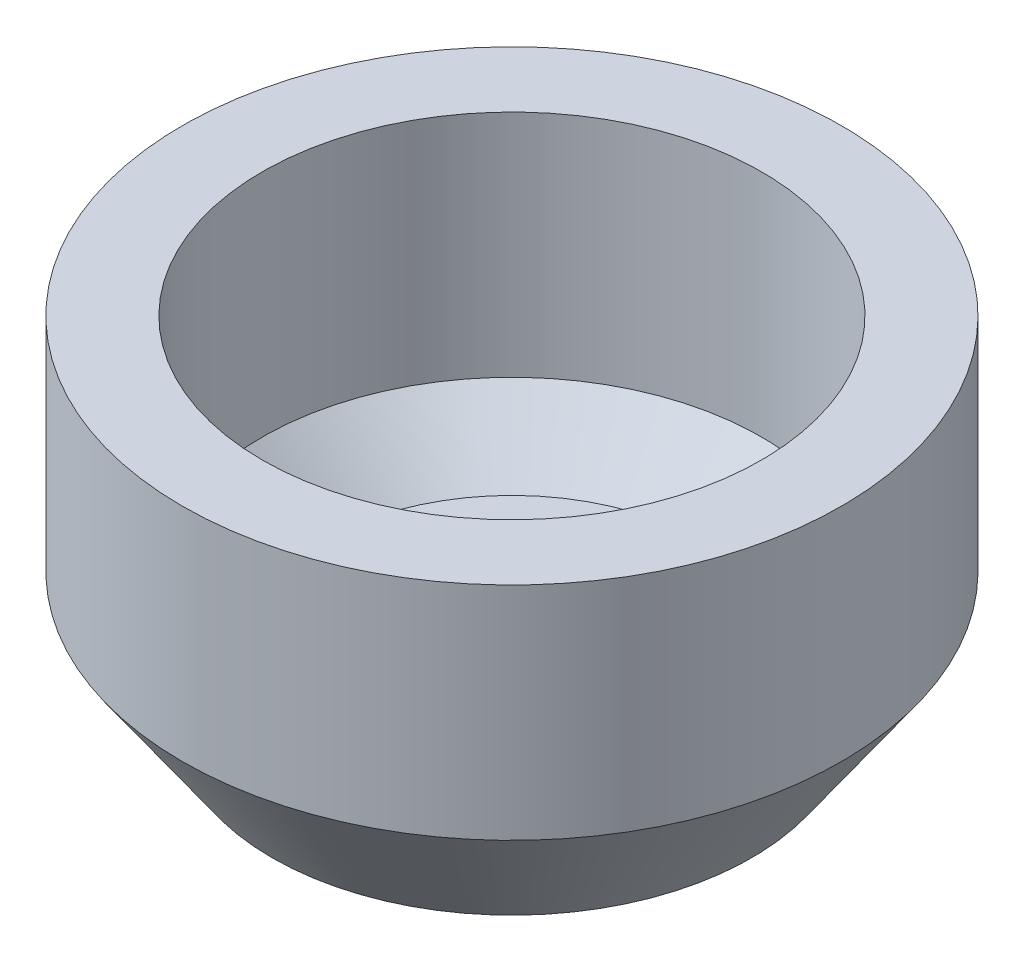
ISO-10303-21;
HEADER;
FILE_DESCRIPTION(('STEP AP214'),'2;1');
FILE_NAME('part.step','',(''),(''),'','','');
FILE_SCHEMA(('AUTOMOTIVE_DESIGN { 1 0 10303 214 1 1 1 1 }'));
ENDSEC;
DATA;
#1=APPLICATION_CONTEXT('core data for automotive mechanical design processes');
#2=APPLICATION_PROTOCOL_DEFINITION('international standard','automotive_design',2000,#1);
#3=PRODUCT_CONTEXT('',#1,'mechanical');
#4=PRODUCT('Part','Part','',(#3));
#5=PRODUCT_RELATED_PRODUCT_CATEGORY('part','',(#4));
#6=PRODUCT_DEFINITION_FORMATION('','',#4);
#7=PRODUCT_DEFINITION_CONTEXT('part definition',#1,'design');
#8=PRODUCT_DEFINITION('design','',#6,#7);
#9=PRODUCT_DEFINITION_SHAPE('','',#8);
#10=(LENGTH_UNIT() NAMED_UNIT(*) SI_UNIT(.MILLI.,.METRE.));
#11=(NAMED_UNIT(*) PLANE_ANGLE_UNIT() SI_UNIT($,.RADIAN.));
#12=(NAMED_UNIT(*) SI_UNIT($,.STERADIAN.) SOLID_ANGLE_UNIT());
#13=UNCERTAINTY_MEASURE_WITH_UNIT(LENGTH_MEASURE(1.E-05),#10,'distance_accuracy_value','');
#14=(GEOMETRIC_REPRESENTATION_CONTEXT(3) GLOBAL_UNCERTAINTY_ASSIGNED_CONTEXT((#13)) GLOBAL_UNIT_ASSIGNED_CONTEXT((#10,
#11,#12)) REPRESENTATION_CONTEXT('',''));
#15=CARTESIAN_POINT('',(0.,0.,0.));
#16=DIRECTION('',(0.,0.,1.));
#17=DIRECTION('',(1.,0.,0.));
#18=AXIS2_PLACEMENT_3D('',#15,#16,#17);
#19=CARTESIAN_POINT('',(0.,3.5,0.));
#20=DIRECTION('',(0.,-1.,0.));
#21=DIRECTION('',(0.,0.,-1.));
#22=AXIS2_PLACEMENT_3D('',#19,#20,#21);
#23=CYLINDRICAL_SURFACE('',#22,3.3);
#24=CARTESIAN_POINT('',(0.,3.5,0.));
#25=DIRECTION('',(0.,1.,0.));
#26=DIRECTION('',(0.,0.,1.));
#27=AXIS2_PLACEMENT_3D('',#24,#25,#26);
#28=CIRCLE('',#27,3.3);
#29=CARTESIAN_POINT('',(0.,3.5,3.3));
#30=VERTEX_POINT('',#29);
#31=EDGE_CURVE('E62',#30,#30,#28,.T.);
#32=ORIENTED_EDGE('',*,*,#31,.F.);
#33=EDGE_LOOP('',(#32));
#34=FACE_BOUND('',#33,.T.);
#35=CARTESIAN_POINT('',(0.,1.28533320606791,0.));
#36=DIRECTION('',(0.,1.,0.));
#37=DIRECTION('',(0.,0.,1.));
#38=AXIS2_PLACEMENT_3D('',#35,#36,#37);
#39=CIRCLE('',#38,3.3);
#40=CARTESIAN_POINT('',(0.,1.28533320606791,3.3));
#41=VERTEX_POINT('',#40);
#42=EDGE_CURVE('E52',#41,#41,#39,.F.);
#43=ORIENTED_EDGE('',*,*,#42,.F.);
#44=EDGE_LOOP('',(#43));
#45=FACE_BOUND('',#44,.T.);
#46=ADVANCED_FACE('F49',(#34,#45),#23,.T.);
#47=CARTESIAN_POINT('',(0.,3.5,0.));
#48=DIRECTION('',(0.,1.,0.));
#49=DIRECTION('',(0.,0.,1.));
#50=AXIS2_PLACEMENT_3D('',#47,#48,#49);
#51=PLANE('',#50);
#52=ORIENTED_EDGE('',*,*,#31,.T.);
#53=EDGE_LOOP('',(#52));
#54=FACE_BOUND('',#53,.T.);
#55=CARTESIAN_POINT('',(0.,3.5,0.));
#56=DIRECTION('',(0.,1.,0.));
#57=DIRECTION('',(0.,0.,1.));
#58=AXIS2_PLACEMENT_3D('',#55,#56,#57);
#59=CIRCLE('',#58,2.5);
#60=CARTESIAN_POINT('',(0.,3.5,2.5));
#61=VERTEX_POINT('',#60);
#62=EDGE_CURVE('E68',#61,#61,#59,.T.);
#63=ORIENTED_EDGE('',*,*,#62,.F.);
#64=EDGE_LOOP('',(#63));
#65=FACE_BOUND('',#64,.T.);
#66=ADVANCED_FACE('F84',(#54,#65),#51,.T.);
#67=CARTESIAN_POINT('',(0.,3.5,0.));
#68=DIRECTION('',(0.,-1.,0.));
#69=DIRECTION('',(0.,0.,-1.));
#70=AXIS2_PLACEMENT_3D('',#67,#68,#69);
#71=CYLINDRICAL_SURFACE('',#70,2.5);
#72=CARTESIAN_POINT('',(0.,1.2,0.));
#73=DIRECTION('',(0.,1.,0.));
#74=DIRECTION('',(0.,0.,1.));
#75=AXIS2_PLACEMENT_3D('',#72,#73,#74);
#76=CIRCLE('',#75,2.5);
#77=CARTESIAN_POINT('',(0.,1.2,2.5));
#78=VERTEX_POINT('',#77);
#79=EDGE_CURVE('E12',#78,#78,#76,.T.);
#80=ORIENTED_EDGE('',*,*,#79,.F.);
#81=EDGE_LOOP('',(#80));
#82=FACE_BOUND('',#81,.T.);
#83=ORIENTED_EDGE('',*,*,#62,.T.);
#84=EDGE_LOOP('',(#83));
#85=FACE_BOUND('',#84,.T.);
#86=ADVANCED_FACE('F89',(#82,#85),#71,.F.);
#87=CARTESIAN_POINT('',(0.,1.2,0.));
#88=DIRECTION('',(0.,1.,0.));
#89=DIRECTION('',(0.,0.,1.));
#90=AXIS2_PLACEMENT_3D('',#87,#88,#89);
#91=CONICAL_SURFACE('',#90,2.5,0.785398163397453);
#92=CARTESIAN_POINT('',(0.,0.6,0.));
#93=DIRECTION('',(0.,1.,0.));
#94=DIRECTION('',(0.,0.,1.));
#95=AXIS2_PLACEMENT_3D('',#92,#93,#94);
#96=CIRCLE('',#95,1.89999999999999);
#97=CARTESIAN_POINT('',(0.,0.6,1.89999999999999));
#98=VERTEX_POINT('',#97);
#99=EDGE_CURVE('E57',#98,#98,#96,.F.);
#100=ORIENTED_EDGE('',*,*,#99,.T.);
#101=EDGE_LOOP('',(#100));
#102=FACE_BOUND('',#101,.T.);
#103=ORIENTED_EDGE('',*,*,#79,.T.);
#104=EDGE_LOOP('',(#103));
#105=FACE_BOUND('',#104,.T.);
#106=ADVANCED_FACE('F97',(#102,#105),#91,.F.);
#107=CARTESIAN_POINT('',(0.,0.6,0.));
#108=DIRECTION('',(0.,1.,0.));
#109=DIRECTION('',(0.,0.,1.));
#110=AXIS2_PLACEMENT_3D('',#107,#108,#109);
#111=PLANE('',#110);
#112=ORIENTED_EDGE('',*,*,#99,.F.);
#113=EDGE_LOOP('',(#112));
#114=FACE_BOUND('',#113,.T.);
#115=ADVANCED_FACE('F103',(#114),#111,.T.);
#116=CARTESIAN_POINT('',(0.,0.,0.));
#117=DIRECTION('',(0.,1.,0.));
#118=DIRECTION('',(0.,0.,1.));
#119=AXIS2_PLACEMENT_3D('',#116,#117,#118);
#120=CONICAL_SURFACE('',#119,2.4,0.610865238198013);
#121=CARTESIAN_POINT('',(0.,0.,0.));
#122=DIRECTION('',(0.,-1.,0.));
#123=DIRECTION('',(0.,0.,-1.));
#124=AXIS2_PLACEMENT_3D('',#121,#122,#123);
#125=CIRCLE('',#124,2.4);
#126=CARTESIAN_POINT('',(0.,0.,-2.4));
#127=VERTEX_POINT('',#126);
#128=EDGE_CURVE('E72',#127,#127,#125,.T.);
#129=ORIENTED_EDGE('',*,*,#128,.F.);
#130=EDGE_LOOP('',(#129));
#131=FACE_BOUND('',#130,.T.);
#132=ORIENTED_EDGE('',*,*,#42,.T.);
#133=EDGE_LOOP('',(#132));
#134=FACE_BOUND('',#133,.T.);
#135=ADVANCED_FACE('F81',(#131,#134),#120,.T.);
#136=CARTESIAN_POINT('',(0.,0.,0.));
#137=DIRECTION('',(0.,1.,0.));
#138=DIRECTION('',(0.,0.,1.));
#139=AXIS2_PLACEMENT_3D('',#136,#137,#138);
#140=PLANE('',#139);
#141=ORIENTED_EDGE('',*,*,#128,.T.);
#142=EDGE_LOOP('',(#141));
#143=FACE_BOUND('',#142,.T.);
#144=ADVANCED_FACE('F107',(#143),#140,.F.);
#145=CLOSED_SHELL('',(#46,#66,#86,#106,#115,#135,#144));
#146=MANIFOLD_SOLID_BREP('B2',#145);
#147=ADVANCED_BREP_SHAPE_REPRESENTATION('',(#18,#146),#14);
#148=SHAPE_DEFINITION_REPRESENTATION(#9,#147);
ENDSEC;
END-ISO-10303-21;
